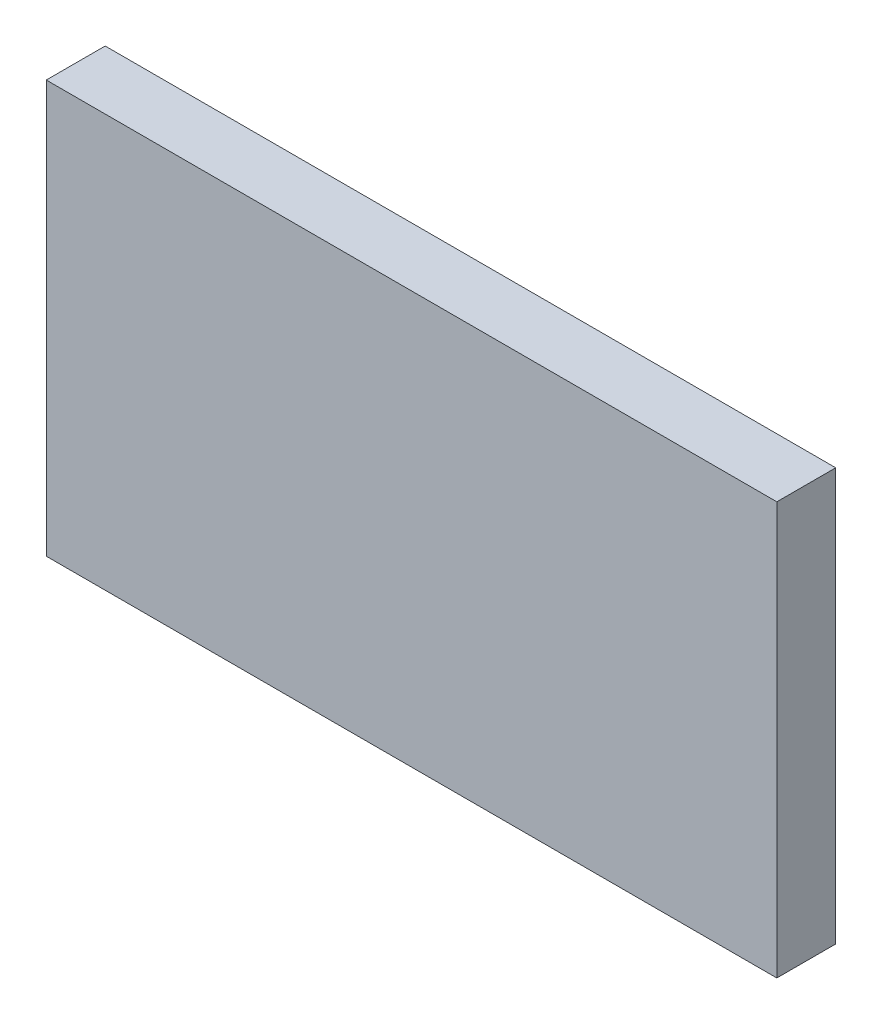
ISO-10303-21;
HEADER;
FILE_DESCRIPTION(('STEP AP214'),'2;1');
FILE_NAME('part.step','',(''),(''),'','','');
FILE_SCHEMA(('AUTOMOTIVE_DESIGN { 1 0 10303 214 1 1 1 1 }'));
ENDSEC;
DATA;
#1=APPLICATION_CONTEXT('core data for automotive mechanical design processes');
#2=APPLICATION_PROTOCOL_DEFINITION('international standard','automotive_design',2000,#1);
#3=PRODUCT_CONTEXT('',#1,'mechanical');
#4=PRODUCT('Part','Part','',(#3));
#5=PRODUCT_RELATED_PRODUCT_CATEGORY('part','',(#4));
#6=PRODUCT_DEFINITION_FORMATION('','',#4);
#7=PRODUCT_DEFINITION_CONTEXT('part definition',#1,'design');
#8=PRODUCT_DEFINITION('design','',#6,#7);
#9=PRODUCT_DEFINITION_SHAPE('','',#8);
#10=(LENGTH_UNIT() NAMED_UNIT(*) SI_UNIT(.MILLI.,.METRE.));
#11=(NAMED_UNIT(*) PLANE_ANGLE_UNIT() SI_UNIT($,.RADIAN.));
#12=(NAMED_UNIT(*) SI_UNIT($,.STERADIAN.) SOLID_ANGLE_UNIT());
#13=UNCERTAINTY_MEASURE_WITH_UNIT(LENGTH_MEASURE(1.E-05),#10,'distance_accuracy_value','');
#14=(GEOMETRIC_REPRESENTATION_CONTEXT(3) GLOBAL_UNCERTAINTY_ASSIGNED_CONTEXT((#13)) GLOBAL_UNIT_ASSIGNED_CONTEXT((#10,
#11,#12)) REPRESENTATION_CONTEXT('',''));
#15=CARTESIAN_POINT('',(0.,0.,0.));
#16=DIRECTION('',(0.,0.,1.));
#17=DIRECTION('',(1.,0.,0.));
#18=AXIS2_PLACEMENT_3D('',#15,#16,#17);
#19=CARTESIAN_POINT('',(0.,0.,10.));
#20=DIRECTION('',(1.,0.,0.));
#21=DIRECTION('',(0.,0.,-1.));
#22=AXIS2_PLACEMENT_3D('',#19,#20,#21);
#23=PLANE('',#22);
#24=DIRECTION('',(0.,-1.,0.));
#25=VECTOR('',#24,1.);
#26=CARTESIAN_POINT('',(0.,0.,0.));
#27=LINE('',#26,#25);
#28=CARTESIAN_POINT('',(0.,70.,0.));
#29=VERTEX_POINT('',#28);
#30=CARTESIAN_POINT('',(0.,0.,0.));
#31=VERTEX_POINT('',#30);
#32=EDGE_CURVE('E96',#29,#31,#27,.T.);
#33=ORIENTED_EDGE('',*,*,#32,.T.);
#34=DIRECTION('',(0.,0.,-1.));
#35=VECTOR('',#34,1.);
#36=CARTESIAN_POINT('',(0.,0.,10.));
#37=LINE('',#36,#35);
#38=CARTESIAN_POINT('',(0.,0.,10.));
#39=VERTEX_POINT('',#38);
#40=EDGE_CURVE('E11',#39,#31,#37,.T.);
#41=ORIENTED_EDGE('',*,*,#40,.F.);
#42=DIRECTION('',(0.,-1.,0.));
#43=VECTOR('',#42,1.);
#44=CARTESIAN_POINT('',(0.,0.,10.));
#45=LINE('',#44,#43);
#46=CARTESIAN_POINT('',(0.,70.,10.));
#47=VERTEX_POINT('',#46);
#48=EDGE_CURVE('E84',#47,#39,#45,.T.);
#49=ORIENTED_EDGE('',*,*,#48,.F.);
#50=DIRECTION('',(0.,0.,-1.));
#51=VECTOR('',#50,1.);
#52=CARTESIAN_POINT('',(0.,70.,10.));
#53=LINE('',#52,#51);
#54=EDGE_CURVE('E92',#47,#29,#53,.T.);
#55=ORIENTED_EDGE('',*,*,#54,.T.);
#56=EDGE_LOOP('',(#33,#41,#49,#55));
#57=FACE_BOUND('',#56,.T.);
#58=ADVANCED_FACE('F33',(#57),#23,.F.);
#59=CARTESIAN_POINT('',(0.,0.,10.));
#60=DIRECTION('',(0.,1.,0.));
#61=DIRECTION('',(0.,0.,1.));
#62=AXIS2_PLACEMENT_3D('',#59,#60,#61);
#63=PLANE('',#62);
#64=DIRECTION('',(1.,0.,0.));
#65=VECTOR('',#64,1.);
#66=CARTESIAN_POINT('',(0.,0.,0.));
#67=LINE('',#66,#65);
#68=CARTESIAN_POINT('',(124.,0.,0.));
#69=VERTEX_POINT('',#68);
#70=EDGE_CURVE('E88',#31,#69,#67,.T.);
#71=ORIENTED_EDGE('',*,*,#70,.T.);
#72=DIRECTION('',(0.,0.,-1.));
#73=VECTOR('',#72,1.);
#74=CARTESIAN_POINT('',(124.,0.,10.));
#75=LINE('',#74,#73);
#76=CARTESIAN_POINT('',(124.,0.,10.));
#77=VERTEX_POINT('',#76);
#78=EDGE_CURVE('E41',#77,#69,#75,.T.);
#79=ORIENTED_EDGE('',*,*,#78,.F.);
#80=DIRECTION('',(1.,0.,0.));
#81=VECTOR('',#80,1.);
#82=CARTESIAN_POINT('',(0.,0.,10.));
#83=LINE('',#82,#81);
#84=EDGE_CURVE('E79',#39,#77,#83,.T.);
#85=ORIENTED_EDGE('',*,*,#84,.F.);
#86=ORIENTED_EDGE('',*,*,#40,.T.);
#87=EDGE_LOOP('',(#71,#79,#85,#86));
#88=FACE_BOUND('',#87,.T.);
#89=ADVANCED_FACE('F87',(#88),#63,.F.);
#90=CARTESIAN_POINT('',(124.,0.,10.));
#91=DIRECTION('',(-1.,0.,0.));
#92=DIRECTION('',(0.,0.,1.));
#93=AXIS2_PLACEMENT_3D('',#90,#91,#92);
#94=PLANE('',#93);
#95=DIRECTION('',(0.,1.,0.));
#96=VECTOR('',#95,1.);
#97=CARTESIAN_POINT('',(124.,0.,0.));
#98=LINE('',#97,#96);
#99=CARTESIAN_POINT('',(124.,70.,0.));
#100=VERTEX_POINT('',#99);
#101=EDGE_CURVE('E66',#69,#100,#98,.T.);
#102=ORIENTED_EDGE('',*,*,#101,.T.);
#103=DIRECTION('',(0.,0.,-1.));
#104=VECTOR('',#103,1.);
#105=CARTESIAN_POINT('',(124.,70.,10.));
#106=LINE('',#105,#104);
#107=CARTESIAN_POINT('',(124.,70.,10.));
#108=VERTEX_POINT('',#107);
#109=EDGE_CURVE('E89',#108,#100,#106,.T.);
#110=ORIENTED_EDGE('',*,*,#109,.F.);
#111=DIRECTION('',(0.,1.,0.));
#112=VECTOR('',#111,1.);
#113=CARTESIAN_POINT('',(124.,0.,10.));
#114=LINE('',#113,#112);
#115=EDGE_CURVE('E82',#77,#108,#114,.T.);
#116=ORIENTED_EDGE('',*,*,#115,.F.);
#117=ORIENTED_EDGE('',*,*,#78,.T.);
#118=EDGE_LOOP('',(#102,#110,#116,#117));
#119=FACE_BOUND('',#118,.T.);
#120=ADVANCED_FACE('F90',(#119),#94,.F.);
#121=CARTESIAN_POINT('',(0.,70.,10.));
#122=DIRECTION('',(0.,-1.,0.));
#123=DIRECTION('',(0.,0.,-1.));
#124=AXIS2_PLACEMENT_3D('',#121,#122,#123);
#125=PLANE('',#124);
#126=DIRECTION('',(-1.,0.,0.));
#127=VECTOR('',#126,1.);
#128=CARTESIAN_POINT('',(0.,70.,0.));
#129=LINE('',#128,#127);
#130=EDGE_CURVE('E72',#100,#29,#129,.T.);
#131=ORIENTED_EDGE('',*,*,#130,.T.);
#132=ORIENTED_EDGE('',*,*,#54,.F.);
#133=DIRECTION('',(-1.,0.,0.));
#134=VECTOR('',#133,1.);
#135=CARTESIAN_POINT('',(0.,70.,10.));
#136=LINE('',#135,#134);
#137=EDGE_CURVE('E49',#108,#47,#136,.T.);
#138=ORIENTED_EDGE('',*,*,#137,.F.);
#139=ORIENTED_EDGE('',*,*,#109,.T.);
#140=EDGE_LOOP('',(#131,#132,#138,#139));
#141=FACE_BOUND('',#140,.T.);
#142=ADVANCED_FACE('F103',(#141),#125,.F.);
#143=CARTESIAN_POINT('',(0.,0.,10.));
#144=DIRECTION('',(0.,0.,-1.));
#145=DIRECTION('',(-1.,0.,0.));
#146=AXIS2_PLACEMENT_3D('',#143,#144,#145);
#147=PLANE('',#146);
#148=ORIENTED_EDGE('',*,*,#48,.T.);
#149=ORIENTED_EDGE('',*,*,#84,.T.);
#150=ORIENTED_EDGE('',*,*,#115,.T.);
#151=ORIENTED_EDGE('',*,*,#137,.T.);
#152=EDGE_LOOP('',(#148,#149,#150,#151));
#153=FACE_BOUND('',#152,.T.);
#154=ADVANCED_FACE('F80',(#153),#147,.F.);
#155=CARTESIAN_POINT('',(0.,0.,0.));
#156=DIRECTION('',(0.,0.,-1.));
#157=DIRECTION('',(-1.,0.,0.));
#158=AXIS2_PLACEMENT_3D('',#155,#156,#157);
#159=PLANE('',#158);
#160=ORIENTED_EDGE('',*,*,#32,.F.);
#161=ORIENTED_EDGE('',*,*,#130,.F.);
#162=ORIENTED_EDGE('',*,*,#101,.F.);
#163=ORIENTED_EDGE('',*,*,#70,.F.);
#164=EDGE_LOOP('',(#160,#161,#162,#163));
#165=FACE_BOUND('',#164,.T.);
#166=ADVANCED_FACE('F106',(#165),#159,.T.);
#167=CLOSED_SHELL('',(#58,#89,#120,#142,#154,#166));
#168=MANIFOLD_SOLID_BREP('B2',#167);
#169=ADVANCED_BREP_SHAPE_REPRESENTATION('',(#18,#168),#14);
#170=SHAPE_DEFINITION_REPRESENTATION(#9,#169);
ENDSEC;
END-ISO-10303-21;
